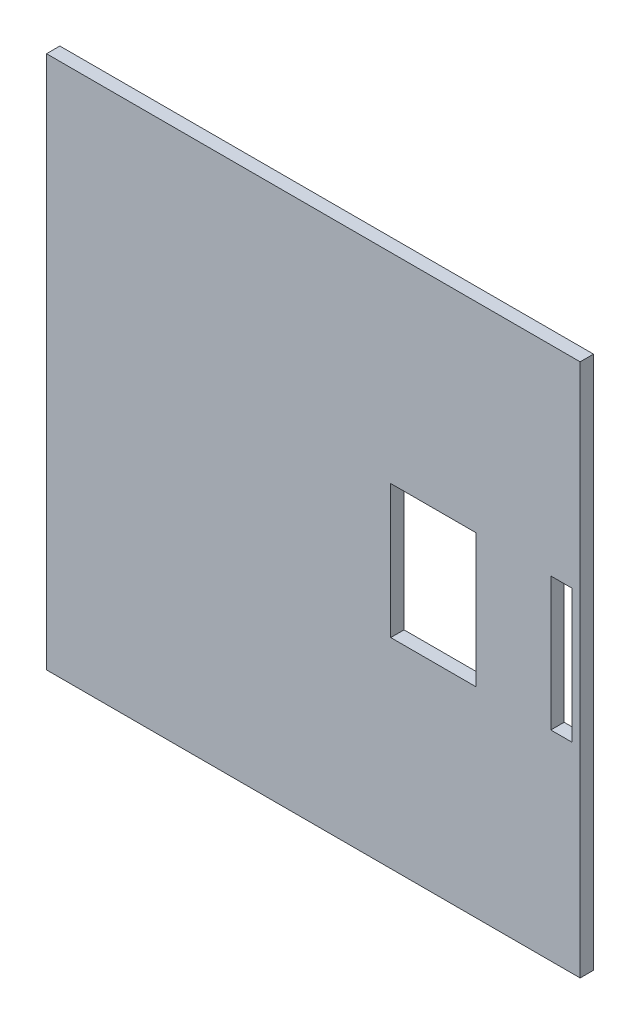
ISO-10303-21;
HEADER;
FILE_DESCRIPTION(('STEP AP214'),'2;1');
FILE_NAME('part.step','',(''),(''),'','','');
FILE_SCHEMA(('AUTOMOTIVE_DESIGN { 1 0 10303 214 1 1 1 1 }'));
ENDSEC;
DATA;
#1=APPLICATION_CONTEXT('core data for automotive mechanical design processes');
#2=APPLICATION_PROTOCOL_DEFINITION('international standard','automotive_design',2000,#1);
#3=PRODUCT_CONTEXT('',#1,'mechanical');
#4=PRODUCT('Part','Part','',(#3));
#5=PRODUCT_RELATED_PRODUCT_CATEGORY('part','',(#4));
#6=PRODUCT_DEFINITION_FORMATION('','',#4);
#7=PRODUCT_DEFINITION_CONTEXT('part definition',#1,'design');
#8=PRODUCT_DEFINITION('design','',#6,#7);
#9=PRODUCT_DEFINITION_SHAPE('','',#8);
#10=(LENGTH_UNIT() NAMED_UNIT(*) SI_UNIT(.MILLI.,.METRE.));
#11=(NAMED_UNIT(*) PLANE_ANGLE_UNIT() SI_UNIT($,.RADIAN.));
#12=(NAMED_UNIT(*) SI_UNIT($,.STERADIAN.) SOLID_ANGLE_UNIT());
#13=UNCERTAINTY_MEASURE_WITH_UNIT(LENGTH_MEASURE(1.E-05),#10,'distance_accuracy_value','');
#14=(GEOMETRIC_REPRESENTATION_CONTEXT(3) GLOBAL_UNCERTAINTY_ASSIGNED_CONTEXT((#13)) GLOBAL_UNIT_ASSIGNED_CONTEXT((#10,
#11,#12)) REPRESENTATION_CONTEXT('',''));
#15=CARTESIAN_POINT('',(0.,0.,0.));
#16=DIRECTION('',(0.,0.,1.));
#17=DIRECTION('',(1.,0.,0.));
#18=AXIS2_PLACEMENT_3D('',#15,#16,#17);
#19=CARTESIAN_POINT('',(0.,0.,5.));
#20=DIRECTION('',(1.,0.,0.));
#21=DIRECTION('',(0.,0.,-1.));
#22=AXIS2_PLACEMENT_3D('',#19,#20,#21);
#23=PLANE('',#22);
#24=DIRECTION('',(0.,-1.,0.));
#25=VECTOR('',#24,1.);
#26=CARTESIAN_POINT('',(0.,0.,0.));
#27=LINE('',#26,#25);
#28=CARTESIAN_POINT('',(0.,200.,0.));
#29=VERTEX_POINT('',#28);
#30=CARTESIAN_POINT('',(0.,0.,0.));
#31=VERTEX_POINT('',#30);
#32=EDGE_CURVE('E182',#29,#31,#27,.T.);
#33=ORIENTED_EDGE('',*,*,#32,.T.);
#34=DIRECTION('',(0.,0.,-1.));
#35=VECTOR('',#34,1.);
#36=CARTESIAN_POINT('',(0.,0.,5.));
#37=LINE('',#36,#35);
#38=CARTESIAN_POINT('',(0.,0.,5.));
#39=VERTEX_POINT('',#38);
#40=EDGE_CURVE('E11',#39,#31,#37,.T.);
#41=ORIENTED_EDGE('',*,*,#40,.F.);
#42=DIRECTION('',(0.,-1.,0.));
#43=VECTOR('',#42,1.);
#44=CARTESIAN_POINT('',(0.,0.,5.));
#45=LINE('',#44,#43);
#46=CARTESIAN_POINT('',(0.,200.,5.));
#47=VERTEX_POINT('',#46);
#48=EDGE_CURVE('E189',#47,#39,#45,.T.);
#49=ORIENTED_EDGE('',*,*,#48,.F.);
#50=DIRECTION('',(0.,0.,-1.));
#51=VECTOR('',#50,1.);
#52=CARTESIAN_POINT('',(0.,200.,5.));
#53=LINE('',#52,#51);
#54=EDGE_CURVE('E199',#47,#29,#53,.T.);
#55=ORIENTED_EDGE('',*,*,#54,.T.);
#56=EDGE_LOOP('',(#33,#41,#49,#55));
#57=FACE_BOUND('',#56,.T.);
#58=ADVANCED_FACE('F32',(#57),#23,.F.);
#59=CARTESIAN_POINT('',(0.,0.,5.));
#60=DIRECTION('',(0.,1.,0.));
#61=DIRECTION('',(0.,0.,1.));
#62=AXIS2_PLACEMENT_3D('',#59,#60,#61);
#63=PLANE('',#62);
#64=DIRECTION('',(1.,0.,0.));
#65=VECTOR('',#64,1.);
#66=CARTESIAN_POINT('',(0.,0.,0.));
#67=LINE('',#66,#65);
#68=CARTESIAN_POINT('',(200.,0.,0.));
#69=VERTEX_POINT('',#68);
#70=EDGE_CURVE('E202',#31,#69,#67,.T.);
#71=ORIENTED_EDGE('',*,*,#70,.T.);
#72=DIRECTION('',(0.,0.,-1.));
#73=VECTOR('',#72,1.);
#74=CARTESIAN_POINT('',(200.,0.,5.));
#75=LINE('',#74,#73);
#76=CARTESIAN_POINT('',(200.,0.,5.));
#77=VERTEX_POINT('',#76);
#78=EDGE_CURVE('E39',#77,#69,#75,.T.);
#79=ORIENTED_EDGE('',*,*,#78,.F.);
#80=DIRECTION('',(1.,0.,0.));
#81=VECTOR('',#80,1.);
#82=CARTESIAN_POINT('',(0.,0.,5.));
#83=LINE('',#82,#81);
#84=EDGE_CURVE('E192',#39,#77,#83,.T.);
#85=ORIENTED_EDGE('',*,*,#84,.F.);
#86=ORIENTED_EDGE('',*,*,#40,.T.);
#87=EDGE_LOOP('',(#71,#79,#85,#86));
#88=FACE_BOUND('',#87,.T.);
#89=ADVANCED_FACE('F231',(#88),#63,.F.);
#90=CARTESIAN_POINT('',(200.,0.,5.));
#91=DIRECTION('',(-1.,0.,0.));
#92=DIRECTION('',(0.,0.,1.));
#93=AXIS2_PLACEMENT_3D('',#90,#91,#92);
#94=PLANE('',#93);
#95=DIRECTION('',(0.,1.,0.));
#96=VECTOR('',#95,1.);
#97=CARTESIAN_POINT('',(200.,0.,0.));
#98=LINE('',#97,#96);
#99=CARTESIAN_POINT('',(200.,200.,0.));
#100=VERTEX_POINT('',#99);
#101=EDGE_CURVE('E204',#69,#100,#98,.T.);
#102=ORIENTED_EDGE('',*,*,#101,.T.);
#103=DIRECTION('',(0.,0.,-1.));
#104=VECTOR('',#103,1.);
#105=CARTESIAN_POINT('',(200.,200.,5.));
#106=LINE('',#105,#104);
#107=CARTESIAN_POINT('',(200.,200.,5.));
#108=VERTEX_POINT('',#107);
#109=EDGE_CURVE('E209',#108,#100,#106,.T.);
#110=ORIENTED_EDGE('',*,*,#109,.F.);
#111=DIRECTION('',(0.,1.,0.));
#112=VECTOR('',#111,1.);
#113=CARTESIAN_POINT('',(200.,0.,5.));
#114=LINE('',#113,#112);
#115=EDGE_CURVE('E195',#77,#108,#114,.T.);
#116=ORIENTED_EDGE('',*,*,#115,.F.);
#117=ORIENTED_EDGE('',*,*,#78,.T.);
#118=EDGE_LOOP('',(#102,#110,#116,#117));
#119=FACE_BOUND('',#118,.T.);
#120=ADVANCED_FACE('F216',(#119),#94,.F.);
#121=CARTESIAN_POINT('',(0.,200.,5.));
#122=DIRECTION('',(0.,-1.,0.));
#123=DIRECTION('',(0.,0.,-1.));
#124=AXIS2_PLACEMENT_3D('',#121,#122,#123);
#125=PLANE('',#124);
#126=DIRECTION('',(-1.,0.,0.));
#127=VECTOR('',#126,1.);
#128=CARTESIAN_POINT('',(0.,200.,0.));
#129=LINE('',#128,#127);
#130=EDGE_CURVE('E193',#100,#29,#129,.T.);
#131=ORIENTED_EDGE('',*,*,#130,.T.);
#132=ORIENTED_EDGE('',*,*,#54,.F.);
#133=DIRECTION('',(-1.,0.,0.));
#134=VECTOR('',#133,1.);
#135=CARTESIAN_POINT('',(0.,200.,5.));
#136=LINE('',#135,#134);
#137=EDGE_CURVE('E197',#108,#47,#136,.T.);
#138=ORIENTED_EDGE('',*,*,#137,.F.);
#139=ORIENTED_EDGE('',*,*,#109,.T.);
#140=EDGE_LOOP('',(#131,#132,#138,#139));
#141=FACE_BOUND('',#140,.T.);
#142=ADVANCED_FACE('F224',(#141),#125,.F.);
#143=CARTESIAN_POINT('',(0.,0.,5.));
#144=DIRECTION('',(0.,0.,-1.));
#145=DIRECTION('',(-1.,0.,0.));
#146=AXIS2_PLACEMENT_3D('',#143,#144,#145);
#147=PLANE('',#146);
#148=DIRECTION('',(-1.,0.,0.));
#149=VECTOR('',#148,1.);
#150=CARTESIAN_POINT('',(161.,125.,5.));
#151=LINE('',#150,#149);
#152=CARTESIAN_POINT('',(161.,125.,5.));
#153=VERTEX_POINT('',#152);
#154=CARTESIAN_POINT('',(129.,125.,5.));
#155=VERTEX_POINT('',#154);
#156=EDGE_CURVE('E147',#153,#155,#151,.T.);
#157=ORIENTED_EDGE('',*,*,#156,.F.);
#158=DIRECTION('',(0.,1.,0.));
#159=VECTOR('',#158,1.);
#160=CARTESIAN_POINT('',(161.,125.,5.));
#161=LINE('',#160,#159);
#162=CARTESIAN_POINT('',(161.,75.,5.));
#163=VERTEX_POINT('',#162);
#164=EDGE_CURVE('E46',#163,#153,#161,.T.);
#165=ORIENTED_EDGE('',*,*,#164,.F.);
#166=DIRECTION('',(1.,0.,0.));
#167=VECTOR('',#166,1.);
#168=CARTESIAN_POINT('',(161.,75.,5.));
#169=LINE('',#168,#167);
#170=CARTESIAN_POINT('',(129.,75.,5.));
#171=VERTEX_POINT('',#170);
#172=EDGE_CURVE('E138',#171,#163,#169,.T.);
#173=ORIENTED_EDGE('',*,*,#172,.F.);
#174=DIRECTION('',(0.,-1.,0.));
#175=VECTOR('',#174,1.);
#176=CARTESIAN_POINT('',(129.,125.,5.));
#177=LINE('',#176,#175);
#178=EDGE_CURVE('E141',#155,#171,#177,.T.);
#179=ORIENTED_EDGE('',*,*,#178,.F.);
#180=EDGE_LOOP('',(#157,#165,#173,#179));
#181=FACE_BOUND('',#180,.T.);
#182=DIRECTION('',(1.,0.,0.));
#183=VECTOR('',#182,1.);
#184=CARTESIAN_POINT('',(189.,75.,5.));
#185=LINE('',#184,#183);
#186=CARTESIAN_POINT('',(189.,75.,5.));
#187=VERTEX_POINT('',#186);
#188=CARTESIAN_POINT('',(197.,75.,5.));
#189=VERTEX_POINT('',#188);
#190=EDGE_CURVE('E172',#187,#189,#185,.T.);
#191=ORIENTED_EDGE('',*,*,#190,.F.);
#192=DIRECTION('',(0.,-1.,0.));
#193=VECTOR('',#192,1.);
#194=CARTESIAN_POINT('',(189.,125.,5.));
#195=LINE('',#194,#193);
#196=CARTESIAN_POINT('',(189.,125.,5.));
#197=VERTEX_POINT('',#196);
#198=EDGE_CURVE('E153',#197,#187,#195,.T.);
#199=ORIENTED_EDGE('',*,*,#198,.F.);
#200=DIRECTION('',(-1.,0.,0.));
#201=VECTOR('',#200,1.);
#202=CARTESIAN_POINT('',(189.,125.,5.));
#203=LINE('',#202,#201);
#204=CARTESIAN_POINT('',(197.,125.,5.));
#205=VERTEX_POINT('',#204);
#206=EDGE_CURVE('E161',#205,#197,#203,.T.);
#207=ORIENTED_EDGE('',*,*,#206,.F.);
#208=DIRECTION('',(0.,1.,0.));
#209=VECTOR('',#208,1.);
#210=CARTESIAN_POINT('',(197.,125.,5.));
#211=LINE('',#210,#209);
#212=EDGE_CURVE('E175',#189,#205,#211,.T.);
#213=ORIENTED_EDGE('',*,*,#212,.F.);
#214=EDGE_LOOP('',(#191,#199,#207,#213));
#215=FACE_BOUND('',#214,.T.);
#216=ORIENTED_EDGE('',*,*,#48,.T.);
#217=ORIENTED_EDGE('',*,*,#84,.T.);
#218=ORIENTED_EDGE('',*,*,#115,.T.);
#219=ORIENTED_EDGE('',*,*,#137,.T.);
#220=EDGE_LOOP('',(#216,#217,#218,#219));
#221=FACE_BOUND('',#220,.T.);
#222=ADVANCED_FACE('F230',(#181,#215,#221),#147,.F.);
#223=CARTESIAN_POINT('',(0.,0.,0.));
#224=DIRECTION('',(0.,0.,-1.));
#225=DIRECTION('',(-1.,0.,0.));
#226=AXIS2_PLACEMENT_3D('',#223,#224,#225);
#227=PLANE('',#226);
#228=DIRECTION('',(0.,1.,0.));
#229=VECTOR('',#228,1.);
#230=CARTESIAN_POINT('',(161.,125.,0.));
#231=LINE('',#230,#229);
#232=CARTESIAN_POINT('',(161.,75.,0.));
#233=VERTEX_POINT('',#232);
#234=CARTESIAN_POINT('',(161.,125.,0.));
#235=VERTEX_POINT('',#234);
#236=EDGE_CURVE('E122',#233,#235,#231,.T.);
#237=ORIENTED_EDGE('',*,*,#236,.T.);
#238=DIRECTION('',(-1.,0.,0.));
#239=VECTOR('',#238,1.);
#240=CARTESIAN_POINT('',(161.,125.,0.));
#241=LINE('',#240,#239);
#242=CARTESIAN_POINT('',(129.,125.,0.));
#243=VERTEX_POINT('',#242);
#244=EDGE_CURVE('E131',#235,#243,#241,.T.);
#245=ORIENTED_EDGE('',*,*,#244,.T.);
#246=DIRECTION('',(0.,-1.,0.));
#247=VECTOR('',#246,1.);
#248=CARTESIAN_POINT('',(129.,125.,0.));
#249=LINE('',#248,#247);
#250=CARTESIAN_POINT('',(129.,75.,0.));
#251=VERTEX_POINT('',#250);
#252=EDGE_CURVE('E54',#243,#251,#249,.T.);
#253=ORIENTED_EDGE('',*,*,#252,.T.);
#254=DIRECTION('',(1.,0.,0.));
#255=VECTOR('',#254,1.);
#256=CARTESIAN_POINT('',(161.,75.,0.));
#257=LINE('',#256,#255);
#258=EDGE_CURVE('E128',#251,#233,#257,.T.);
#259=ORIENTED_EDGE('',*,*,#258,.T.);
#260=EDGE_LOOP('',(#237,#245,#253,#259));
#261=FACE_BOUND('',#260,.T.);
#262=DIRECTION('',(0.,-1.,0.));
#263=VECTOR('',#262,1.);
#264=CARTESIAN_POINT('',(189.,125.,0.));
#265=LINE('',#264,#263);
#266=CARTESIAN_POINT('',(189.,125.,0.));
#267=VERTEX_POINT('',#266);
#268=CARTESIAN_POINT('',(189.,75.,0.));
#269=VERTEX_POINT('',#268);
#270=EDGE_CURVE('E157',#267,#269,#265,.T.);
#271=ORIENTED_EDGE('',*,*,#270,.T.);
#272=DIRECTION('',(1.,0.,0.));
#273=VECTOR('',#272,1.);
#274=CARTESIAN_POINT('',(189.,75.,0.));
#275=LINE('',#274,#273);
#276=CARTESIAN_POINT('',(197.,75.,0.));
#277=VERTEX_POINT('',#276);
#278=EDGE_CURVE('E160',#269,#277,#275,.T.);
#279=ORIENTED_EDGE('',*,*,#278,.T.);
#280=DIRECTION('',(0.,1.,0.));
#281=VECTOR('',#280,1.);
#282=CARTESIAN_POINT('',(197.,125.,0.));
#283=LINE('',#282,#281);
#284=CARTESIAN_POINT('',(197.,125.,0.));
#285=VERTEX_POINT('',#284);
#286=EDGE_CURVE('E164',#277,#285,#283,.T.);
#287=ORIENTED_EDGE('',*,*,#286,.T.);
#288=DIRECTION('',(-1.,0.,0.));
#289=VECTOR('',#288,1.);
#290=CARTESIAN_POINT('',(189.,125.,0.));
#291=LINE('',#290,#289);
#292=EDGE_CURVE('E167',#285,#267,#291,.T.);
#293=ORIENTED_EDGE('',*,*,#292,.T.);
#294=EDGE_LOOP('',(#271,#279,#287,#293));
#295=FACE_BOUND('',#294,.T.);
#296=ORIENTED_EDGE('',*,*,#32,.F.);
#297=ORIENTED_EDGE('',*,*,#130,.F.);
#298=ORIENTED_EDGE('',*,*,#101,.F.);
#299=ORIENTED_EDGE('',*,*,#70,.F.);
#300=EDGE_LOOP('',(#296,#297,#298,#299));
#301=FACE_BOUND('',#300,.T.);
#302=ADVANCED_FACE('F135',(#261,#295,#301),#227,.T.);
#303=CARTESIAN_POINT('',(189.,125.,0.));
#304=DIRECTION('',(-1.,0.,0.));
#305=DIRECTION('',(0.,0.,1.));
#306=AXIS2_PLACEMENT_3D('',#303,#304,#305);
#307=PLANE('',#306);
#308=ORIENTED_EDGE('',*,*,#198,.T.);
#309=DIRECTION('',(0.,0.,1.));
#310=VECTOR('',#309,1.);
#311=CARTESIAN_POINT('',(189.,75.,0.));
#312=LINE('',#311,#310);
#313=EDGE_CURVE('E170',#269,#187,#312,.T.);
#314=ORIENTED_EDGE('',*,*,#313,.F.);
#315=ORIENTED_EDGE('',*,*,#270,.F.);
#316=DIRECTION('',(0.,0.,1.));
#317=VECTOR('',#316,1.);
#318=CARTESIAN_POINT('',(189.,125.,0.));
#319=LINE('',#318,#317);
#320=EDGE_CURVE('E180',#267,#197,#319,.T.);
#321=ORIENTED_EDGE('',*,*,#320,.T.);
#322=EDGE_LOOP('',(#308,#314,#315,#321));
#323=FACE_BOUND('',#322,.T.);
#324=ADVANCED_FACE('F243',(#323),#307,.F.);
#325=CARTESIAN_POINT('',(189.,125.,0.));
#326=DIRECTION('',(0.,1.,0.));
#327=DIRECTION('',(0.,0.,1.));
#328=AXIS2_PLACEMENT_3D('',#325,#326,#327);
#329=PLANE('',#328);
#330=ORIENTED_EDGE('',*,*,#206,.T.);
#331=ORIENTED_EDGE('',*,*,#320,.F.);
#332=ORIENTED_EDGE('',*,*,#292,.F.);
#333=DIRECTION('',(0.,0.,1.));
#334=VECTOR('',#333,1.);
#335=CARTESIAN_POINT('',(197.,125.,0.));
#336=LINE('',#335,#334);
#337=EDGE_CURVE('E183',#285,#205,#336,.T.);
#338=ORIENTED_EDGE('',*,*,#337,.T.);
#339=EDGE_LOOP('',(#330,#331,#332,#338));
#340=FACE_BOUND('',#339,.T.);
#341=ADVANCED_FACE('F249',(#340),#329,.F.);
#342=CARTESIAN_POINT('',(197.,125.,0.));
#343=DIRECTION('',(1.,0.,0.));
#344=DIRECTION('',(0.,0.,-1.));
#345=AXIS2_PLACEMENT_3D('',#342,#343,#344);
#346=PLANE('',#345);
#347=ORIENTED_EDGE('',*,*,#212,.T.);
#348=ORIENTED_EDGE('',*,*,#337,.F.);
#349=ORIENTED_EDGE('',*,*,#286,.F.);
#350=DIRECTION('',(0.,0.,1.));
#351=VECTOR('',#350,1.);
#352=CARTESIAN_POINT('',(197.,75.,0.));
#353=LINE('',#352,#351);
#354=EDGE_CURVE('E185',#277,#189,#353,.T.);
#355=ORIENTED_EDGE('',*,*,#354,.T.);
#356=EDGE_LOOP('',(#347,#348,#349,#355));
#357=FACE_BOUND('',#356,.T.);
#358=ADVANCED_FACE('F254',(#357),#346,.F.);
#359=CARTESIAN_POINT('',(189.,75.,0.));
#360=DIRECTION('',(0.,-1.,0.));
#361=DIRECTION('',(0.,0.,-1.));
#362=AXIS2_PLACEMENT_3D('',#359,#360,#361);
#363=PLANE('',#362);
#364=ORIENTED_EDGE('',*,*,#190,.T.);
#365=ORIENTED_EDGE('',*,*,#354,.F.);
#366=ORIENTED_EDGE('',*,*,#278,.F.);
#367=ORIENTED_EDGE('',*,*,#313,.T.);
#368=EDGE_LOOP('',(#364,#365,#366,#367));
#369=FACE_BOUND('',#368,.T.);
#370=ADVANCED_FACE('F251',(#369),#363,.F.);
#371=CARTESIAN_POINT('',(161.,125.,0.));
#372=DIRECTION('',(1.,0.,0.));
#373=DIRECTION('',(0.,0.,-1.));
#374=AXIS2_PLACEMENT_3D('',#371,#372,#373);
#375=PLANE('',#374);
#376=ORIENTED_EDGE('',*,*,#164,.T.);
#377=DIRECTION('',(0.,0.,1.));
#378=VECTOR('',#377,1.);
#379=CARTESIAN_POINT('',(161.,125.,0.));
#380=LINE('',#379,#378);
#381=EDGE_CURVE('E118',#235,#153,#380,.T.);
#382=ORIENTED_EDGE('',*,*,#381,.F.);
#383=ORIENTED_EDGE('',*,*,#236,.F.);
#384=DIRECTION('',(0.,0.,1.));
#385=VECTOR('',#384,1.);
#386=CARTESIAN_POINT('',(161.,75.,0.));
#387=LINE('',#386,#385);
#388=EDGE_CURVE('E151',#233,#163,#387,.T.);
#389=ORIENTED_EDGE('',*,*,#388,.T.);
#390=EDGE_LOOP('',(#376,#382,#383,#389));
#391=FACE_BOUND('',#390,.T.);
#392=ADVANCED_FACE('F120',(#391),#375,.F.);
#393=CARTESIAN_POINT('',(161.,75.,0.));
#394=DIRECTION('',(0.,-1.,0.));
#395=DIRECTION('',(0.,0.,-1.));
#396=AXIS2_PLACEMENT_3D('',#393,#394,#395);
#397=PLANE('',#396);
#398=ORIENTED_EDGE('',*,*,#172,.T.);
#399=ORIENTED_EDGE('',*,*,#388,.F.);
#400=ORIENTED_EDGE('',*,*,#258,.F.);
#401=DIRECTION('',(0.,0.,1.));
#402=VECTOR('',#401,1.);
#403=CARTESIAN_POINT('',(129.,75.,0.));
#404=LINE('',#403,#402);
#405=EDGE_CURVE('E154',#251,#171,#404,.T.);
#406=ORIENTED_EDGE('',*,*,#405,.T.);
#407=EDGE_LOOP('',(#398,#399,#400,#406));
#408=FACE_BOUND('',#407,.T.);
#409=ADVANCED_FACE('F264',(#408),#397,.F.);
#410=CARTESIAN_POINT('',(129.,125.,0.));
#411=DIRECTION('',(-1.,0.,0.));
#412=DIRECTION('',(0.,-1.,0.));
#413=AXIS2_PLACEMENT_3D('',#410,#411,#412);
#414=PLANE('',#413);
#415=ORIENTED_EDGE('',*,*,#178,.T.);
#416=ORIENTED_EDGE('',*,*,#405,.F.);
#417=ORIENTED_EDGE('',*,*,#252,.F.);
#418=DIRECTION('',(0.,0.,1.));
#419=VECTOR('',#418,1.);
#420=CARTESIAN_POINT('',(129.,125.,0.));
#421=LINE('',#420,#419);
#422=EDGE_CURVE('E127',#243,#155,#421,.T.);
#423=ORIENTED_EDGE('',*,*,#422,.T.);
#424=EDGE_LOOP('',(#415,#416,#417,#423));
#425=FACE_BOUND('',#424,.T.);
#426=ADVANCED_FACE('F267',(#425),#414,.F.);
#427=CARTESIAN_POINT('',(161.,125.,0.));
#428=DIRECTION('',(0.,1.,0.));
#429=DIRECTION('',(-1.,0.,0.));
#430=AXIS2_PLACEMENT_3D('',#427,#428,#429);
#431=PLANE('',#430);
#432=ORIENTED_EDGE('',*,*,#156,.T.);
#433=ORIENTED_EDGE('',*,*,#422,.F.);
#434=ORIENTED_EDGE('',*,*,#244,.F.);
#435=ORIENTED_EDGE('',*,*,#381,.T.);
#436=EDGE_LOOP('',(#432,#433,#434,#435));
#437=FACE_BOUND('',#436,.T.);
#438=ADVANCED_FACE('F132',(#437),#431,.F.);
#439=CLOSED_SHELL('',(#58,#89,#120,#142,#222,#302,#324,#341,#358,#370,#392,#409,#426,#438));
#440=MANIFOLD_SOLID_BREP('B2',#439);
#441=ADVANCED_BREP_SHAPE_REPRESENTATION('',(#18,#440),#14);
#442=SHAPE_DEFINITION_REPRESENTATION(#9,#441);
ENDSEC;
END-ISO-10303-21;
